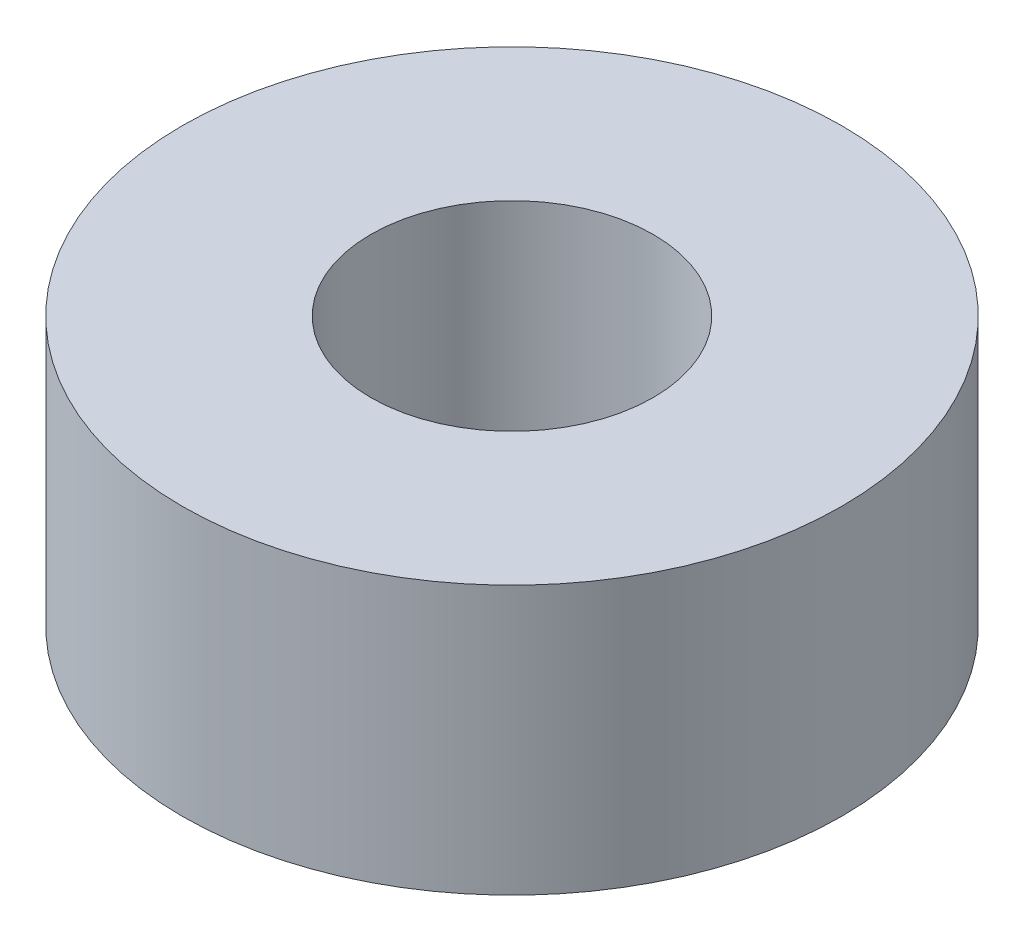
ISO-10303-21;
HEADER;
FILE_DESCRIPTION(('STEP AP214'),'2;1');
FILE_NAME('part.step','',(''),(''),'','','');
FILE_SCHEMA(('AUTOMOTIVE_DESIGN { 1 0 10303 214 1 1 1 1 }'));
ENDSEC;
DATA;
#1=APPLICATION_CONTEXT('core data for automotive mechanical design processes');
#2=APPLICATION_PROTOCOL_DEFINITION('international standard','automotive_design',2000,#1);
#3=PRODUCT_CONTEXT('',#1,'mechanical');
#4=PRODUCT('Part','Part','',(#3));
#5=PRODUCT_RELATED_PRODUCT_CATEGORY('part','',(#4));
#6=PRODUCT_DEFINITION_FORMATION('','',#4);
#7=PRODUCT_DEFINITION_CONTEXT('part definition',#1,'design');
#8=PRODUCT_DEFINITION('design','',#6,#7);
#9=PRODUCT_DEFINITION_SHAPE('','',#8);
#10=(LENGTH_UNIT() NAMED_UNIT(*) SI_UNIT(.MILLI.,.METRE.));
#11=(NAMED_UNIT(*) PLANE_ANGLE_UNIT() SI_UNIT($,.RADIAN.));
#12=(NAMED_UNIT(*) SI_UNIT($,.STERADIAN.) SOLID_ANGLE_UNIT());
#13=UNCERTAINTY_MEASURE_WITH_UNIT(LENGTH_MEASURE(1.E-05),#10,'distance_accuracy_value','');
#14=(GEOMETRIC_REPRESENTATION_CONTEXT(3) GLOBAL_UNCERTAINTY_ASSIGNED_CONTEXT((#13)) GLOBAL_UNIT_ASSIGNED_CONTEXT((#10,
#11,#12)) REPRESENTATION_CONTEXT('',''));
#15=CARTESIAN_POINT('',(0.,0.,0.));
#16=DIRECTION('',(0.,0.,1.));
#17=DIRECTION('',(1.,0.,0.));
#18=AXIS2_PLACEMENT_3D('',#15,#16,#17);
#19=CARTESIAN_POINT('',(0.,5.7,0.));
#20=DIRECTION('',(0.,1.,0.));
#21=DIRECTION('',(0.,0.,-1.));
#22=AXIS2_PLACEMENT_3D('',#19,#20,#21);
#23=PLANE('',#22);
#24=CARTESIAN_POINT('',(0.,5.7,0.));
#25=DIRECTION('',(0.,-1.,0.));
#26=DIRECTION('',(0.,0.,-1.));
#27=AXIS2_PLACEMENT_3D('',#24,#25,#26);
#28=CIRCLE('',#27,7.);
#29=CARTESIAN_POINT('',(0.,5.7,-7.));
#30=VERTEX_POINT('',#29);
#31=EDGE_CURVE('E10',#30,#30,#28,.T.);
#32=ORIENTED_EDGE('',*,*,#31,.F.);
#33=EDGE_LOOP('',(#32));
#34=FACE_BOUND('',#33,.T.);
#35=CARTESIAN_POINT('',(0.,5.7,0.));
#36=DIRECTION('',(0.,-1.,0.));
#37=DIRECTION('',(0.,0.,-1.));
#38=AXIS2_PLACEMENT_3D('',#35,#36,#37);
#39=CIRCLE('',#38,3.);
#40=CARTESIAN_POINT('',(0.,5.7,-3.));
#41=VERTEX_POINT('',#40);
#42=EDGE_CURVE('E46',#41,#41,#39,.T.);
#43=ORIENTED_EDGE('',*,*,#42,.T.);
#44=EDGE_LOOP('',(#43));
#45=FACE_BOUND('',#44,.T.);
#46=ADVANCED_FACE('F35',(#34,#45),#23,.T.);
#47=CARTESIAN_POINT('',(0.,0.,0.));
#48=DIRECTION('',(0.,1.,0.));
#49=DIRECTION('',(0.,0.,-1.));
#50=AXIS2_PLACEMENT_3D('',#47,#48,#49);
#51=PLANE('',#50);
#52=CARTESIAN_POINT('',(0.,0.,0.));
#53=DIRECTION('',(0.,-1.,0.));
#54=DIRECTION('',(0.,0.,-1.));
#55=AXIS2_PLACEMENT_3D('',#52,#53,#54);
#56=CIRCLE('',#55,7.);
#57=CARTESIAN_POINT('',(0.,0.,-7.));
#58=VERTEX_POINT('',#57);
#59=EDGE_CURVE('E39',#58,#58,#56,.T.);
#60=ORIENTED_EDGE('',*,*,#59,.T.);
#61=EDGE_LOOP('',(#60));
#62=FACE_BOUND('',#61,.T.);
#63=CARTESIAN_POINT('',(0.,0.,0.));
#64=DIRECTION('',(0.,-1.,0.));
#65=DIRECTION('',(0.,0.,-1.));
#66=AXIS2_PLACEMENT_3D('',#63,#64,#65);
#67=CIRCLE('',#66,3.);
#68=CARTESIAN_POINT('',(0.,0.,-3.));
#69=VERTEX_POINT('',#68);
#70=EDGE_CURVE('E48',#69,#69,#67,.T.);
#71=ORIENTED_EDGE('',*,*,#70,.F.);
#72=EDGE_LOOP('',(#71));
#73=FACE_BOUND('',#72,.T.);
#74=ADVANCED_FACE('F61',(#62,#73),#51,.F.);
#75=CARTESIAN_POINT('',(0.,5.7,0.));
#76=DIRECTION('',(0.,-1.,0.));
#77=DIRECTION('',(0.,0.,1.));
#78=AXIS2_PLACEMENT_3D('',#75,#76,#77);
#79=CYLINDRICAL_SURFACE('',#78,7.);
#80=ORIENTED_EDGE('',*,*,#31,.T.);
#81=EDGE_LOOP('',(#80));
#82=FACE_BOUND('',#81,.T.);
#83=ORIENTED_EDGE('',*,*,#59,.F.);
#84=EDGE_LOOP('',(#83));
#85=FACE_BOUND('',#84,.T.);
#86=ADVANCED_FACE('F37',(#82,#85),#79,.T.);
#87=CARTESIAN_POINT('',(0.,5.7,0.));
#88=DIRECTION('',(0.,-1.,0.));
#89=DIRECTION('',(0.,0.,1.));
#90=AXIS2_PLACEMENT_3D('',#87,#88,#89);
#91=CYLINDRICAL_SURFACE('',#90,3.);
#92=ORIENTED_EDGE('',*,*,#42,.F.);
#93=EDGE_LOOP('',(#92));
#94=FACE_BOUND('',#93,.T.);
#95=ORIENTED_EDGE('',*,*,#70,.T.);
#96=EDGE_LOOP('',(#95));
#97=FACE_BOUND('',#96,.T.);
#98=ADVANCED_FACE('F55',(#94,#97),#91,.F.);
#99=CLOSED_SHELL('',(#46,#74,#86,#98));
#100=MANIFOLD_SOLID_BREP('B2',#99);
#101=ADVANCED_BREP_SHAPE_REPRESENTATION('',(#18,#100),#14);
#102=SHAPE_DEFINITION_REPRESENTATION(#9,#101);
ENDSEC;
END-ISO-10303-21;
